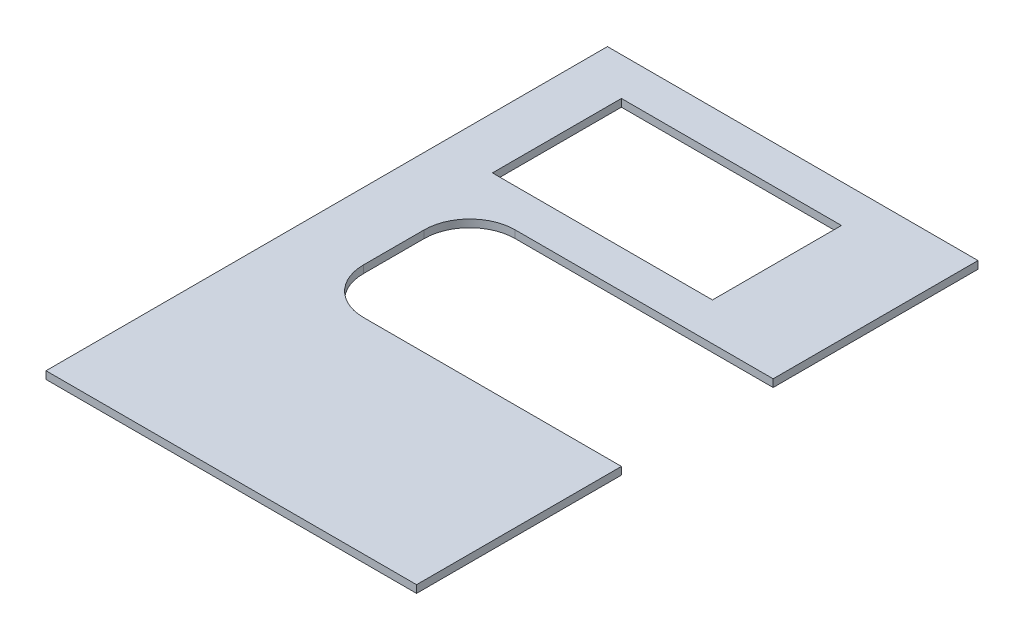
ISO-10303-21;
HEADER;
FILE_DESCRIPTION(('STEP AP214'),'2;1');
FILE_NAME('part.step','',(''),(''),'','','');
FILE_SCHEMA(('AUTOMOTIVE_DESIGN { 1 0 10303 214 1 1 1 1 }'));
ENDSEC;
DATA;
#1=APPLICATION_CONTEXT('core data for automotive mechanical design processes');
#2=APPLICATION_PROTOCOL_DEFINITION('international standard','automotive_design',2000,#1);
#3=PRODUCT_CONTEXT('',#1,'mechanical');
#4=PRODUCT('Part','Part','',(#3));
#5=PRODUCT_RELATED_PRODUCT_CATEGORY('part','',(#4));
#6=PRODUCT_DEFINITION_FORMATION('','',#4);
#7=PRODUCT_DEFINITION_CONTEXT('part definition',#1,'design');
#8=PRODUCT_DEFINITION('design','',#6,#7);
#9=PRODUCT_DEFINITION_SHAPE('','',#8);
#10=(LENGTH_UNIT() NAMED_UNIT(*) SI_UNIT(.MILLI.,.METRE.));
#11=(NAMED_UNIT(*) PLANE_ANGLE_UNIT() SI_UNIT($,.RADIAN.));
#12=(NAMED_UNIT(*) SI_UNIT($,.STERADIAN.) SOLID_ANGLE_UNIT());
#13=UNCERTAINTY_MEASURE_WITH_UNIT(LENGTH_MEASURE(1.E-05),#10,'distance_accuracy_value','');
#14=(GEOMETRIC_REPRESENTATION_CONTEXT(3) GLOBAL_UNCERTAINTY_ASSIGNED_CONTEXT((#13)) GLOBAL_UNIT_ASSIGNED_CONTEXT((#10,
#11,#12)) REPRESENTATION_CONTEXT('',''));
#15=CARTESIAN_POINT('',(0.,0.,0.));
#16=DIRECTION('',(0.,0.,1.));
#17=DIRECTION('',(1.,0.,0.));
#18=AXIS2_PLACEMENT_3D('',#15,#16,#17);
#19=CARTESIAN_POINT('',(310.134,6.35,0.));
#20=DIRECTION('',(-1.,0.,0.));
#21=DIRECTION('',(0.,0.,1.));
#22=AXIS2_PLACEMENT_3D('',#19,#20,#21);
#23=PLANE('',#22);
#24=DIRECTION('',(0.,0.,-1.));
#25=VECTOR('',#24,1.);
#26=CARTESIAN_POINT('',(310.134,6.35,0.));
#27=LINE('',#26,#25);
#28=CARTESIAN_POINT('',(310.134,6.35,-298.45));
#29=VERTEX_POINT('',#28);
#30=CARTESIAN_POINT('',(310.134,6.35,-469.9));
#31=VERTEX_POINT('',#30);
#32=EDGE_CURVE('E197',#29,#31,#27,.T.);
#33=ORIENTED_EDGE('',*,*,#32,.F.);
#34=DIRECTION('',(0.,1.,0.));
#35=VECTOR('',#34,1.);
#36=CARTESIAN_POINT('',(310.134,0.,-298.45));
#37=LINE('',#36,#35);
#38=CARTESIAN_POINT('',(310.134,0.,-298.45));
#39=VERTEX_POINT('',#38);
#40=EDGE_CURVE('E186',#39,#29,#37,.T.);
#41=ORIENTED_EDGE('',*,*,#40,.F.);
#42=DIRECTION('',(0.,0.,-1.));
#43=VECTOR('',#42,1.);
#44=CARTESIAN_POINT('',(310.134,0.,0.));
#45=LINE('',#44,#43);
#46=CARTESIAN_POINT('',(310.134,0.,-469.9));
#47=VERTEX_POINT('',#46);
#48=EDGE_CURVE('E208',#39,#47,#45,.T.);
#49=ORIENTED_EDGE('',*,*,#48,.T.);
#50=DIRECTION('',(0.,-1.,0.));
#51=VECTOR('',#50,1.);
#52=CARTESIAN_POINT('',(310.134,6.35,-469.9));
#53=LINE('',#52,#51);
#54=EDGE_CURVE('E215',#31,#47,#53,.T.);
#55=ORIENTED_EDGE('',*,*,#54,.F.);
#56=EDGE_LOOP('',(#33,#41,#49,#55));
#57=FACE_BOUND('',#56,.T.);
#58=ADVANCED_FACE('F33',(#57),#23,.F.);
#59=CARTESIAN_POINT('',(0.,6.35,0.));
#60=DIRECTION('',(1.,0.,0.));
#61=DIRECTION('',(0.,0.,-1.));
#62=AXIS2_PLACEMENT_3D('',#59,#60,#61);
#63=PLANE('',#62);
#64=DIRECTION('',(0.,0.,1.));
#65=VECTOR('',#64,1.);
#66=CARTESIAN_POINT('',(0.,0.,0.));
#67=LINE('',#66,#65);
#68=CARTESIAN_POINT('',(0.,0.,-469.9));
#69=VERTEX_POINT('',#68);
#70=CARTESIAN_POINT('',(0.,0.,0.));
#71=VERTEX_POINT('',#70);
#72=EDGE_CURVE('E188',#69,#71,#67,.T.);
#73=ORIENTED_EDGE('',*,*,#72,.T.);
#74=DIRECTION('',(0.,-1.,0.));
#75=VECTOR('',#74,1.);
#76=CARTESIAN_POINT('',(0.,6.35,0.));
#77=LINE('',#76,#75);
#78=CARTESIAN_POINT('',(0.,6.35,0.));
#79=VERTEX_POINT('',#78);
#80=EDGE_CURVE('E221',#79,#71,#77,.T.);
#81=ORIENTED_EDGE('',*,*,#80,.F.);
#82=DIRECTION('',(0.,0.,1.));
#83=VECTOR('',#82,1.);
#84=CARTESIAN_POINT('',(0.,6.35,0.));
#85=LINE('',#84,#83);
#86=CARTESIAN_POINT('',(0.,6.35,-469.9));
#87=VERTEX_POINT('',#86);
#88=EDGE_CURVE('E191',#87,#79,#85,.T.);
#89=ORIENTED_EDGE('',*,*,#88,.F.);
#90=DIRECTION('',(0.,-1.,0.));
#91=VECTOR('',#90,1.);
#92=CARTESIAN_POINT('',(0.,6.35,-469.9));
#93=LINE('',#92,#91);
#94=EDGE_CURVE('E203',#87,#69,#93,.T.);
#95=ORIENTED_EDGE('',*,*,#94,.T.);
#96=EDGE_LOOP('',(#73,#81,#89,#95));
#97=FACE_BOUND('',#96,.T.);
#98=ADVANCED_FACE('F265',(#97),#63,.F.);
#99=CARTESIAN_POINT('',(0.,6.35,0.));
#100=DIRECTION('',(0.,0.,-1.));
#101=DIRECTION('',(-1.,0.,0.));
#102=AXIS2_PLACEMENT_3D('',#99,#100,#101);
#103=PLANE('',#102);
#104=DIRECTION('',(1.,0.,0.));
#105=VECTOR('',#104,1.);
#106=CARTESIAN_POINT('',(0.,0.,0.));
#107=LINE('',#106,#105);
#108=CARTESIAN_POINT('',(310.134,0.,0.));
#109=VERTEX_POINT('',#108);
#110=EDGE_CURVE('E206',#71,#109,#107,.T.);
#111=ORIENTED_EDGE('',*,*,#110,.T.);
#112=DIRECTION('',(0.,-1.,0.));
#113=VECTOR('',#112,1.);
#114=CARTESIAN_POINT('',(310.134,6.35,0.));
#115=LINE('',#114,#113);
#116=CARTESIAN_POINT('',(310.134,6.35,0.));
#117=VERTEX_POINT('',#116);
#118=EDGE_CURVE('E218',#117,#109,#115,.T.);
#119=ORIENTED_EDGE('',*,*,#118,.F.);
#120=DIRECTION('',(1.,0.,0.));
#121=VECTOR('',#120,1.);
#122=CARTESIAN_POINT('',(0.,6.35,0.));
#123=LINE('',#122,#121);
#124=EDGE_CURVE('E194',#79,#117,#123,.T.);
#125=ORIENTED_EDGE('',*,*,#124,.F.);
#126=ORIENTED_EDGE('',*,*,#80,.T.);
#127=EDGE_LOOP('',(#111,#119,#125,#126));
#128=FACE_BOUND('',#127,.T.);
#129=ADVANCED_FACE('F262',(#128),#103,.F.);
#130=CARTESIAN_POINT('',(310.134,0.,-171.45));
#131=VERTEX_POINT('',#130);
#132=EDGE_CURVE('E209',#109,#131,#45,.T.);
#133=ORIENTED_EDGE('',*,*,#132,.T.);
#134=DIRECTION('',(0.,1.,0.));
#135=VECTOR('',#134,1.);
#136=CARTESIAN_POINT('',(310.134,0.,-171.45));
#137=LINE('',#136,#135);
#138=CARTESIAN_POINT('',(310.134,6.35,-171.45));
#139=VERTEX_POINT('',#138);
#140=EDGE_CURVE('E179',#131,#139,#137,.T.);
#141=ORIENTED_EDGE('',*,*,#140,.T.);
#142=EDGE_CURVE('E198',#117,#139,#27,.T.);
#143=ORIENTED_EDGE('',*,*,#142,.F.);
#144=ORIENTED_EDGE('',*,*,#118,.T.);
#145=EDGE_LOOP('',(#133,#141,#143,#144));
#146=FACE_BOUND('',#145,.T.);
#147=ADVANCED_FACE('F256',(#146),#23,.F.);
#148=CARTESIAN_POINT('',(0.,6.35,-469.9));
#149=DIRECTION('',(0.,0.,1.));
#150=DIRECTION('',(1.,0.,0.));
#151=AXIS2_PLACEMENT_3D('',#148,#149,#150);
#152=PLANE('',#151);
#153=DIRECTION('',(-1.,0.,0.));
#154=VECTOR('',#153,1.);
#155=CARTESIAN_POINT('',(0.,0.,-469.9));
#156=LINE('',#155,#154);
#157=EDGE_CURVE('E195',#47,#69,#156,.T.);
#158=ORIENTED_EDGE('',*,*,#157,.T.);
#159=ORIENTED_EDGE('',*,*,#94,.F.);
#160=DIRECTION('',(-1.,0.,0.));
#161=VECTOR('',#160,1.);
#162=CARTESIAN_POINT('',(0.,6.35,-469.9));
#163=LINE('',#162,#161);
#164=EDGE_CURVE('E201',#31,#87,#163,.T.);
#165=ORIENTED_EDGE('',*,*,#164,.F.);
#166=ORIENTED_EDGE('',*,*,#54,.T.);
#167=EDGE_LOOP('',(#158,#159,#165,#166));
#168=FACE_BOUND('',#167,.T.);
#169=ADVANCED_FACE('F269',(#168),#152,.F.);
#170=CARTESIAN_POINT('',(0.,6.35,0.));
#171=DIRECTION('',(0.,-1.,0.));
#172=DIRECTION('',(0.,0.,-1.));
#173=AXIS2_PLACEMENT_3D('',#170,#171,#172);
#174=PLANE('',#173);
#175=DIRECTION('',(1.,0.,0.));
#176=VECTOR('',#175,1.);
#177=CARTESIAN_POINT('',(43.434,6.35,-330.2));
#178=LINE('',#177,#176);
#179=CARTESIAN_POINT('',(43.434,6.35,-330.2));
#180=VERTEX_POINT('',#179);
#181=CARTESIAN_POINT('',(227.584,6.35,-330.2));
#182=VERTEX_POINT('',#181);
#183=EDGE_CURVE('E160',#180,#182,#178,.T.);
#184=ORIENTED_EDGE('',*,*,#183,.F.);
#185=DIRECTION('',(0.,0.,1.));
#186=VECTOR('',#185,1.);
#187=CARTESIAN_POINT('',(43.434,6.35,-330.2));
#188=LINE('',#187,#186);
#189=CARTESIAN_POINT('',(43.434,6.35,-438.15));
#190=VERTEX_POINT('',#189);
#191=EDGE_CURVE('E48',#190,#180,#188,.T.);
#192=ORIENTED_EDGE('',*,*,#191,.F.);
#193=DIRECTION('',(-1.,0.,0.));
#194=VECTOR('',#193,1.);
#195=CARTESIAN_POINT('',(43.434,6.35,-438.15));
#196=LINE('',#195,#194);
#197=CARTESIAN_POINT('',(227.584,6.35,-438.15));
#198=VERTEX_POINT('',#197);
#199=EDGE_CURVE('E151',#198,#190,#196,.T.);
#200=ORIENTED_EDGE('',*,*,#199,.F.);
#201=DIRECTION('',(0.,0.,-1.));
#202=VECTOR('',#201,1.);
#203=CARTESIAN_POINT('',(227.584,6.35,-330.2));
#204=LINE('',#203,#202);
#205=EDGE_CURVE('E154',#182,#198,#204,.T.);
#206=ORIENTED_EDGE('',*,*,#205,.F.);
#207=EDGE_LOOP('',(#184,#192,#200,#206));
#208=FACE_BOUND('',#207,.T.);
#209=DIRECTION('',(0.,0.,1.));
#210=VECTOR('',#209,1.);
#211=CARTESIAN_POINT('',(56.134,6.35,-171.45));
#212=LINE('',#211,#210);
#213=CARTESIAN_POINT('',(56.134,6.35,-260.35));
#214=VERTEX_POINT('',#213);
#215=CARTESIAN_POINT('',(56.134,6.35,-209.55));
#216=VERTEX_POINT('',#215);
#217=EDGE_CURVE('E166',#214,#216,#212,.T.);
#218=ORIENTED_EDGE('',*,*,#217,.F.);
#219=CARTESIAN_POINT('',(94.234,6.35,-260.35));
#220=DIRECTION('',(0.,-1.,0.));
#221=DIRECTION('',(0.,0.,-1.));
#222=AXIS2_PLACEMENT_3D('',#219,#220,#221);
#223=CIRCLE('',#222,38.1);
#224=CARTESIAN_POINT('',(94.234,6.35,-298.45));
#225=VERTEX_POINT('',#224);
#226=EDGE_CURVE('E234',#214,#225,#223,.T.);
#227=ORIENTED_EDGE('',*,*,#226,.T.);
#228=DIRECTION('',(-1.,0.,0.));
#229=VECTOR('',#228,1.);
#230=CARTESIAN_POINT('',(56.134,6.35,-298.45));
#231=LINE('',#230,#229);
#232=EDGE_CURVE('E174',#29,#225,#231,.T.);
#233=ORIENTED_EDGE('',*,*,#232,.F.);
#234=ORIENTED_EDGE('',*,*,#32,.T.);
#235=ORIENTED_EDGE('',*,*,#164,.T.);
#236=ORIENTED_EDGE('',*,*,#88,.T.);
#237=ORIENTED_EDGE('',*,*,#124,.T.);
#238=ORIENTED_EDGE('',*,*,#142,.T.);
#239=DIRECTION('',(1.,0.,0.));
#240=VECTOR('',#239,1.);
#241=CARTESIAN_POINT('',(56.134,6.35,-171.45));
#242=LINE('',#241,#240);
#243=CARTESIAN_POINT('',(94.234,6.35,-171.45));
#244=VERTEX_POINT('',#243);
#245=EDGE_CURVE('E182',#244,#139,#242,.T.);
#246=ORIENTED_EDGE('',*,*,#245,.F.);
#247=CARTESIAN_POINT('',(94.234,6.35,-209.55));
#248=DIRECTION('',(0.,-1.,0.));
#249=DIRECTION('',(0.,0.,-1.));
#250=AXIS2_PLACEMENT_3D('',#247,#248,#249);
#251=CIRCLE('',#250,38.1);
#252=EDGE_CURVE('E41',#244,#216,#251,.T.);
#253=ORIENTED_EDGE('',*,*,#252,.T.);
#254=EDGE_LOOP('',(#218,#227,#233,#234,#235,#236,#237,#238,#246,#253));
#255=FACE_BOUND('',#254,.T.);
#256=ADVANCED_FACE('F240',(#208,#255),#174,.F.);
#257=CARTESIAN_POINT('',(0.,0.,0.));
#258=DIRECTION('',(0.,-1.,0.));
#259=DIRECTION('',(0.,0.,-1.));
#260=AXIS2_PLACEMENT_3D('',#257,#258,#259);
#261=PLANE('',#260);
#262=DIRECTION('',(0.,0.,1.));
#263=VECTOR('',#262,1.);
#264=CARTESIAN_POINT('',(43.434,0.,-330.2));
#265=LINE('',#264,#263);
#266=CARTESIAN_POINT('',(43.434,0.,-438.15));
#267=VERTEX_POINT('',#266);
#268=CARTESIAN_POINT('',(43.434,0.,-330.2));
#269=VERTEX_POINT('',#268);
#270=EDGE_CURVE('E135',#267,#269,#265,.T.);
#271=ORIENTED_EDGE('',*,*,#270,.T.);
#272=DIRECTION('',(1.,0.,0.));
#273=VECTOR('',#272,1.);
#274=CARTESIAN_POINT('',(43.434,0.,-330.2));
#275=LINE('',#274,#273);
#276=CARTESIAN_POINT('',(227.584,0.,-330.2));
#277=VERTEX_POINT('',#276);
#278=EDGE_CURVE('E144',#269,#277,#275,.T.);
#279=ORIENTED_EDGE('',*,*,#278,.T.);
#280=DIRECTION('',(0.,0.,-1.));
#281=VECTOR('',#280,1.);
#282=CARTESIAN_POINT('',(227.584,0.,-330.2));
#283=LINE('',#282,#281);
#284=CARTESIAN_POINT('',(227.584,0.,-438.15));
#285=VERTEX_POINT('',#284);
#286=EDGE_CURVE('E56',#277,#285,#283,.T.);
#287=ORIENTED_EDGE('',*,*,#286,.T.);
#288=DIRECTION('',(-1.,0.,0.));
#289=VECTOR('',#288,1.);
#290=CARTESIAN_POINT('',(43.434,0.,-438.15));
#291=LINE('',#290,#289);
#292=EDGE_CURVE('E141',#285,#267,#291,.T.);
#293=ORIENTED_EDGE('',*,*,#292,.T.);
#294=EDGE_LOOP('',(#271,#279,#287,#293));
#295=FACE_BOUND('',#294,.T.);
#296=DIRECTION('',(-1.,0.,0.));
#297=VECTOR('',#296,1.);
#298=CARTESIAN_POINT('',(56.134,0.,-298.45));
#299=LINE('',#298,#297);
#300=CARTESIAN_POINT('',(94.234,0.,-298.45));
#301=VERTEX_POINT('',#300);
#302=EDGE_CURVE('E176',#39,#301,#299,.T.);
#303=ORIENTED_EDGE('',*,*,#302,.T.);
#304=CARTESIAN_POINT('',(94.234,0.,-260.35));
#305=DIRECTION('',(0.,-1.,0.));
#306=DIRECTION('',(0.,0.,-1.));
#307=AXIS2_PLACEMENT_3D('',#304,#305,#306);
#308=CIRCLE('',#307,38.1);
#309=CARTESIAN_POINT('',(56.134,0.,-260.35));
#310=VERTEX_POINT('',#309);
#311=EDGE_CURVE('E236',#301,#310,#308,.F.);
#312=ORIENTED_EDGE('',*,*,#311,.T.);
#313=DIRECTION('',(0.,0.,1.));
#314=VECTOR('',#313,1.);
#315=CARTESIAN_POINT('',(56.134,0.,-171.45));
#316=LINE('',#315,#314);
#317=CARTESIAN_POINT('',(56.134,0.,-209.55));
#318=VERTEX_POINT('',#317);
#319=EDGE_CURVE('E170',#310,#318,#316,.T.);
#320=ORIENTED_EDGE('',*,*,#319,.T.);
#321=CARTESIAN_POINT('',(94.234,0.,-209.55));
#322=DIRECTION('',(0.,-1.,0.));
#323=DIRECTION('',(0.,0.,-1.));
#324=AXIS2_PLACEMENT_3D('',#321,#322,#323);
#325=CIRCLE('',#324,38.1);
#326=CARTESIAN_POINT('',(94.234,0.,-171.45));
#327=VERTEX_POINT('',#326);
#328=EDGE_CURVE('E11',#318,#327,#325,.F.);
#329=ORIENTED_EDGE('',*,*,#328,.T.);
#330=DIRECTION('',(1.,0.,0.));
#331=VECTOR('',#330,1.);
#332=CARTESIAN_POINT('',(56.134,0.,-171.45));
#333=LINE('',#332,#331);
#334=EDGE_CURVE('E173',#327,#131,#333,.T.);
#335=ORIENTED_EDGE('',*,*,#334,.T.);
#336=ORIENTED_EDGE('',*,*,#132,.F.);
#337=ORIENTED_EDGE('',*,*,#110,.F.);
#338=ORIENTED_EDGE('',*,*,#72,.F.);
#339=ORIENTED_EDGE('',*,*,#157,.F.);
#340=ORIENTED_EDGE('',*,*,#48,.F.);
#341=EDGE_LOOP('',(#303,#312,#320,#329,#335,#336,#337,#338,#339,#340));
#342=FACE_BOUND('',#341,.T.);
#343=ADVANCED_FACE('F148',(#295,#342),#261,.T.);
#344=CARTESIAN_POINT('',(56.134,0.,-171.45));
#345=DIRECTION('',(-1.,0.,0.));
#346=DIRECTION('',(0.,0.,1.));
#347=AXIS2_PLACEMENT_3D('',#344,#345,#346);
#348=PLANE('',#347);
#349=ORIENTED_EDGE('',*,*,#319,.F.);
#350=DIRECTION('',(0.,1.,0.));
#351=VECTOR('',#350,1.);
#352=CARTESIAN_POINT('',(56.134,6.35,-260.35));
#353=LINE('',#352,#351);
#354=EDGE_CURVE('E226',#310,#214,#353,.T.);
#355=ORIENTED_EDGE('',*,*,#354,.T.);
#356=ORIENTED_EDGE('',*,*,#217,.T.);
#357=DIRECTION('',(0.,1.,0.));
#358=VECTOR('',#357,1.);
#359=CARTESIAN_POINT('',(56.134,0.,-209.55));
#360=LINE('',#359,#358);
#361=EDGE_CURVE('E224',#216,#318,#360,.F.);
#362=ORIENTED_EDGE('',*,*,#361,.T.);
#363=EDGE_LOOP('',(#349,#355,#356,#362));
#364=FACE_BOUND('',#363,.T.);
#365=ADVANCED_FACE('F246',(#364),#348,.F.);
#366=CARTESIAN_POINT('',(56.134,0.,-298.45));
#367=DIRECTION('',(0.,0.,-1.));
#368=DIRECTION('',(-1.,0.,0.));
#369=AXIS2_PLACEMENT_3D('',#366,#367,#368);
#370=PLANE('',#369);
#371=ORIENTED_EDGE('',*,*,#232,.T.);
#372=DIRECTION('',(0.,1.,0.));
#373=VECTOR('',#372,1.);
#374=CARTESIAN_POINT('',(94.234,0.,-298.45));
#375=LINE('',#374,#373);
#376=EDGE_CURVE('E229',#225,#301,#375,.F.);
#377=ORIENTED_EDGE('',*,*,#376,.T.);
#378=ORIENTED_EDGE('',*,*,#302,.F.);
#379=ORIENTED_EDGE('',*,*,#40,.T.);
#380=EDGE_LOOP('',(#371,#377,#378,#379));
#381=FACE_BOUND('',#380,.T.);
#382=ADVANCED_FACE('F278',(#381),#370,.F.);
#383=CARTESIAN_POINT('',(56.134,0.,-171.45));
#384=DIRECTION('',(0.,0.,1.));
#385=DIRECTION('',(1.,0.,0.));
#386=AXIS2_PLACEMENT_3D('',#383,#384,#385);
#387=PLANE('',#386);
#388=ORIENTED_EDGE('',*,*,#334,.F.);
#389=DIRECTION('',(0.,1.,0.));
#390=VECTOR('',#389,1.);
#391=CARTESIAN_POINT('',(94.234,6.35,-171.45));
#392=LINE('',#391,#390);
#393=EDGE_CURVE('E231',#327,#244,#392,.T.);
#394=ORIENTED_EDGE('',*,*,#393,.T.);
#395=ORIENTED_EDGE('',*,*,#245,.T.);
#396=ORIENTED_EDGE('',*,*,#140,.F.);
#397=EDGE_LOOP('',(#388,#394,#395,#396));
#398=FACE_BOUND('',#397,.T.);
#399=ADVANCED_FACE('F253',(#398),#387,.F.);
#400=CARTESIAN_POINT('',(94.234,0.,-260.35));
#401=DIRECTION('',(0.,-1.,0.));
#402=DIRECTION('',(0.,0.,-1.));
#403=AXIS2_PLACEMENT_3D('',#400,#401,#402);
#404=CYLINDRICAL_SURFACE('',#403,38.1);
#405=ORIENTED_EDGE('',*,*,#311,.F.);
#406=ORIENTED_EDGE('',*,*,#376,.F.);
#407=ORIENTED_EDGE('',*,*,#226,.F.);
#408=ORIENTED_EDGE('',*,*,#354,.F.);
#409=EDGE_LOOP('',(#405,#406,#407,#408));
#410=FACE_BOUND('',#409,.T.);
#411=ADVANCED_FACE('F281',(#410),#404,.F.);
#412=CARTESIAN_POINT('',(94.234,0.,-209.55));
#413=DIRECTION('',(0.,-1.,0.));
#414=DIRECTION('',(0.,0.,-1.));
#415=AXIS2_PLACEMENT_3D('',#412,#413,#414);
#416=CYLINDRICAL_SURFACE('',#415,38.1);
#417=ORIENTED_EDGE('',*,*,#328,.F.);
#418=ORIENTED_EDGE('',*,*,#361,.F.);
#419=ORIENTED_EDGE('',*,*,#252,.F.);
#420=ORIENTED_EDGE('',*,*,#393,.F.);
#421=EDGE_LOOP('',(#417,#418,#419,#420));
#422=FACE_BOUND('',#421,.T.);
#423=ADVANCED_FACE('F35',(#422),#416,.F.);
#424=CARTESIAN_POINT('',(43.434,0.,-330.2));
#425=DIRECTION('',(-1.,0.,0.));
#426=DIRECTION('',(0.,0.,1.));
#427=AXIS2_PLACEMENT_3D('',#424,#425,#426);
#428=PLANE('',#427);
#429=ORIENTED_EDGE('',*,*,#191,.T.);
#430=DIRECTION('',(0.,1.,0.));
#431=VECTOR('',#430,1.);
#432=CARTESIAN_POINT('',(43.434,0.,-330.2));
#433=LINE('',#432,#431);
#434=EDGE_CURVE('E131',#269,#180,#433,.T.);
#435=ORIENTED_EDGE('',*,*,#434,.F.);
#436=ORIENTED_EDGE('',*,*,#270,.F.);
#437=DIRECTION('',(0.,1.,0.));
#438=VECTOR('',#437,1.);
#439=CARTESIAN_POINT('',(43.434,0.,-438.15));
#440=LINE('',#439,#438);
#441=EDGE_CURVE('E164',#267,#190,#440,.T.);
#442=ORIENTED_EDGE('',*,*,#441,.T.);
#443=EDGE_LOOP('',(#429,#435,#436,#442));
#444=FACE_BOUND('',#443,.T.);
#445=ADVANCED_FACE('F133',(#444),#428,.F.);
#446=CARTESIAN_POINT('',(43.434,0.,-438.15));
#447=DIRECTION('',(0.,0.,-1.));
#448=DIRECTION('',(-1.,0.,0.));
#449=AXIS2_PLACEMENT_3D('',#446,#447,#448);
#450=PLANE('',#449);
#451=ORIENTED_EDGE('',*,*,#199,.T.);
#452=ORIENTED_EDGE('',*,*,#441,.F.);
#453=ORIENTED_EDGE('',*,*,#292,.F.);
#454=DIRECTION('',(0.,1.,0.));
#455=VECTOR('',#454,1.);
#456=CARTESIAN_POINT('',(227.584,0.,-438.15));
#457=LINE('',#456,#455);
#458=EDGE_CURVE('E167',#285,#198,#457,.T.);
#459=ORIENTED_EDGE('',*,*,#458,.T.);
#460=EDGE_LOOP('',(#451,#452,#453,#459));
#461=FACE_BOUND('',#460,.T.);
#462=ADVANCED_FACE('F375',(#461),#450,.F.);
#463=CARTESIAN_POINT('',(227.584,0.,-330.2));
#464=DIRECTION('',(1.,0.,0.));
#465=DIRECTION('',(0.,0.,-1.));
#466=AXIS2_PLACEMENT_3D('',#463,#464,#465);
#467=PLANE('',#466);
#468=ORIENTED_EDGE('',*,*,#205,.T.);
#469=ORIENTED_EDGE('',*,*,#458,.F.);
#470=ORIENTED_EDGE('',*,*,#286,.F.);
#471=DIRECTION('',(0.,1.,0.));
#472=VECTOR('',#471,1.);
#473=CARTESIAN_POINT('',(227.584,0.,-330.2));
#474=LINE('',#473,#472);
#475=EDGE_CURVE('E140',#277,#182,#474,.T.);
#476=ORIENTED_EDGE('',*,*,#475,.T.);
#477=EDGE_LOOP('',(#468,#469,#470,#476));
#478=FACE_BOUND('',#477,.T.);
#479=ADVANCED_FACE('F383',(#478),#467,.F.);
#480=CARTESIAN_POINT('',(43.434,0.,-330.2));
#481=DIRECTION('',(0.,0.,1.));
#482=DIRECTION('',(1.,0.,0.));
#483=AXIS2_PLACEMENT_3D('',#480,#481,#482);
#484=PLANE('',#483);
#485=ORIENTED_EDGE('',*,*,#183,.T.);
#486=ORIENTED_EDGE('',*,*,#475,.F.);
#487=ORIENTED_EDGE('',*,*,#278,.F.);
#488=ORIENTED_EDGE('',*,*,#434,.T.);
#489=EDGE_LOOP('',(#485,#486,#487,#488));
#490=FACE_BOUND('',#489,.T.);
#491=ADVANCED_FACE('F145',(#490),#484,.F.);
#492=CLOSED_SHELL('',(#58,#98,#129,#147,#169,#256,#343,#365,#382,#399,#411,#423,#445,#462,#479,#491));
#493=MANIFOLD_SOLID_BREP('B2',#492);
#494=ADVANCED_BREP_SHAPE_REPRESENTATION('',(#18,#493),#14);
#495=SHAPE_DEFINITION_REPRESENTATION(#9,#494);
ENDSEC;
END-ISO-10303-21;
